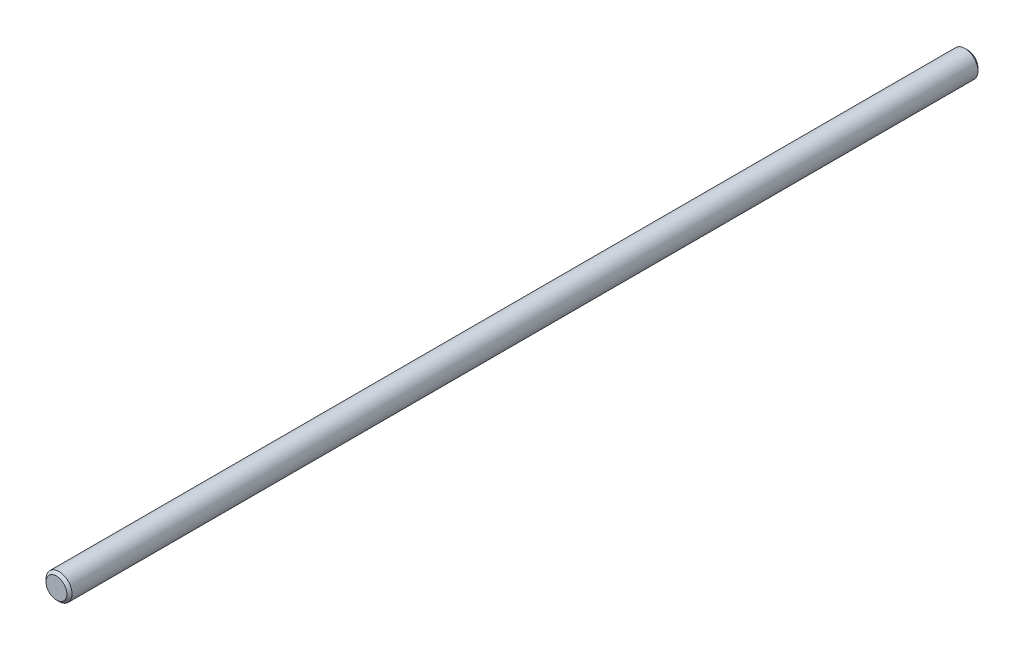
ISO-10303-21;
HEADER;
FILE_DESCRIPTION(('STEP AP214'),'2;1');
FILE_NAME('part.step','',(''),(''),'','','');
FILE_SCHEMA(('AUTOMOTIVE_DESIGN { 1 0 10303 214 1 1 1 1 }'));
ENDSEC;
DATA;
#1=APPLICATION_CONTEXT('core data for automotive mechanical design processes');
#2=APPLICATION_PROTOCOL_DEFINITION('international standard','automotive_design',2000,#1);
#3=PRODUCT_CONTEXT('',#1,'mechanical');
#4=PRODUCT('Part','Part','',(#3));
#5=PRODUCT_RELATED_PRODUCT_CATEGORY('part','',(#4));
#6=PRODUCT_DEFINITION_FORMATION('','',#4);
#7=PRODUCT_DEFINITION_CONTEXT('part definition',#1,'design');
#8=PRODUCT_DEFINITION('design','',#6,#7);
#9=PRODUCT_DEFINITION_SHAPE('','',#8);
#10=(LENGTH_UNIT() NAMED_UNIT(*) SI_UNIT(.MILLI.,.METRE.));
#11=(NAMED_UNIT(*) PLANE_ANGLE_UNIT() SI_UNIT($,.RADIAN.));
#12=(NAMED_UNIT(*) SI_UNIT($,.STERADIAN.) SOLID_ANGLE_UNIT());
#13=UNCERTAINTY_MEASURE_WITH_UNIT(LENGTH_MEASURE(1.E-05),#10,'distance_accuracy_value','');
#14=(GEOMETRIC_REPRESENTATION_CONTEXT(3) GLOBAL_UNCERTAINTY_ASSIGNED_CONTEXT((#13)) GLOBAL_UNIT_ASSIGNED_CONTEXT((#10,
#11,#12)) REPRESENTATION_CONTEXT('',''));
#15=CARTESIAN_POINT('',(0.,0.,0.));
#16=DIRECTION('',(0.,0.,1.));
#17=DIRECTION('',(1.,0.,0.));
#18=AXIS2_PLACEMENT_3D('',#15,#16,#17);
#19=CARTESIAN_POINT('',(0.,0.,350.));
#20=DIRECTION('',(0.,0.,-1.));
#21=DIRECTION('',(-1.,0.,0.));
#22=AXIS2_PLACEMENT_3D('',#19,#20,#21);
#23=CYLINDRICAL_SURFACE('',#22,5.);
#24=CARTESIAN_POINT('',(0.,0.,349.));
#25=DIRECTION('',(0.,0.,1.));
#26=DIRECTION('',(1.,0.,0.));
#27=AXIS2_PLACEMENT_3D('',#24,#25,#26);
#28=CIRCLE('',#27,5.);
#29=CARTESIAN_POINT('',(5.,0.,349.));
#30=VERTEX_POINT('',#29);
#31=EDGE_CURVE('E38',#30,#30,#28,.F.);
#32=ORIENTED_EDGE('',*,*,#31,.T.);
#33=EDGE_LOOP('',(#32));
#34=FACE_BOUND('',#33,.T.);
#35=CARTESIAN_POINT('',(0.,0.,1.00000000000006));
#36=DIRECTION('',(0.,0.,1.));
#37=DIRECTION('',(1.,0.,0.));
#38=AXIS2_PLACEMENT_3D('',#35,#36,#37);
#39=CIRCLE('',#38,5.);
#40=CARTESIAN_POINT('',(5.,0.,1.00000000000006));
#41=VERTEX_POINT('',#40);
#42=EDGE_CURVE('E42',#41,#41,#39,.T.);
#43=ORIENTED_EDGE('',*,*,#42,.T.);
#44=EDGE_LOOP('',(#43));
#45=FACE_BOUND('',#44,.T.);
#46=ADVANCED_FACE('F31',(#34,#45),#23,.T.);
#47=CARTESIAN_POINT('',(0.,0.,350.));
#48=DIRECTION('',(0.,0.,1.));
#49=DIRECTION('',(1.,0.,0.));
#50=AXIS2_PLACEMENT_3D('',#47,#48,#49);
#51=PLANE('',#50);
#52=CARTESIAN_POINT('',(0.,0.,350.));
#53=DIRECTION('',(0.,0.,1.));
#54=DIRECTION('',(1.,0.,0.));
#55=AXIS2_PLACEMENT_3D('',#52,#53,#54);
#56=CIRCLE('',#55,3.99999999999998);
#57=CARTESIAN_POINT('',(3.99999999999998,0.,350.));
#58=VERTEX_POINT('',#57);
#59=EDGE_CURVE('E46',#58,#58,#56,.T.);
#60=ORIENTED_EDGE('',*,*,#59,.T.);
#61=EDGE_LOOP('',(#60));
#62=FACE_BOUND('',#61,.T.);
#63=ADVANCED_FACE('F52',(#62),#51,.T.);
#64=CARTESIAN_POINT('',(0.,0.,0.));
#65=DIRECTION('',(0.,0.,1.));
#66=DIRECTION('',(1.,0.,0.));
#67=AXIS2_PLACEMENT_3D('',#64,#65,#66);
#68=PLANE('',#67);
#69=CARTESIAN_POINT('',(0.,0.,0.));
#70=DIRECTION('',(0.,0.,1.));
#71=DIRECTION('',(1.,0.,0.));
#72=AXIS2_PLACEMENT_3D('',#69,#70,#71);
#73=CIRCLE('',#72,3.99999999999998);
#74=CARTESIAN_POINT('',(3.99999999999998,0.,0.));
#75=VERTEX_POINT('',#74);
#76=EDGE_CURVE('E10',#75,#75,#73,.F.);
#77=ORIENTED_EDGE('',*,*,#76,.T.);
#78=EDGE_LOOP('',(#77));
#79=FACE_BOUND('',#78,.T.);
#80=ADVANCED_FACE('F56',(#79),#68,.F.);
#81=CARTESIAN_POINT('',(0.,0.,350.));
#82=DIRECTION('',(0.,0.,-1.));
#83=DIRECTION('',(-1.,0.,0.));
#84=AXIS2_PLACEMENT_3D('',#81,#82,#83);
#85=CONICAL_SURFACE('',#84,3.99999999999998,0.78539816339746);
#86=ORIENTED_EDGE('',*,*,#31,.F.);
#87=EDGE_LOOP('',(#86));
#88=FACE_BOUND('',#87,.T.);
#89=ORIENTED_EDGE('',*,*,#59,.F.);
#90=EDGE_LOOP('',(#89));
#91=FACE_BOUND('',#90,.T.);
#92=ADVANCED_FACE('F54',(#88,#91),#85,.T.);
#93=CARTESIAN_POINT('',(0.,0.,1.00000000000006));
#94=DIRECTION('',(0.,0.,1.));
#95=DIRECTION('',(1.,0.,0.));
#96=AXIS2_PLACEMENT_3D('',#93,#94,#95);
#97=CONICAL_SURFACE('',#96,5.,0.785398163397432);
#98=ORIENTED_EDGE('',*,*,#76,.F.);
#99=EDGE_LOOP('',(#98));
#100=FACE_BOUND('',#99,.T.);
#101=ORIENTED_EDGE('',*,*,#42,.F.);
#102=EDGE_LOOP('',(#101));
#103=FACE_BOUND('',#102,.T.);
#104=ADVANCED_FACE('F33',(#100,#103),#97,.T.);
#105=CLOSED_SHELL('',(#46,#63,#80,#92,#104));
#106=MANIFOLD_SOLID_BREP('B2',#105);
#107=ADVANCED_BREP_SHAPE_REPRESENTATION('',(#18,#106),#14);
#108=SHAPE_DEFINITION_REPRESENTATION(#9,#107);
ENDSEC;
END-ISO-10303-21;
